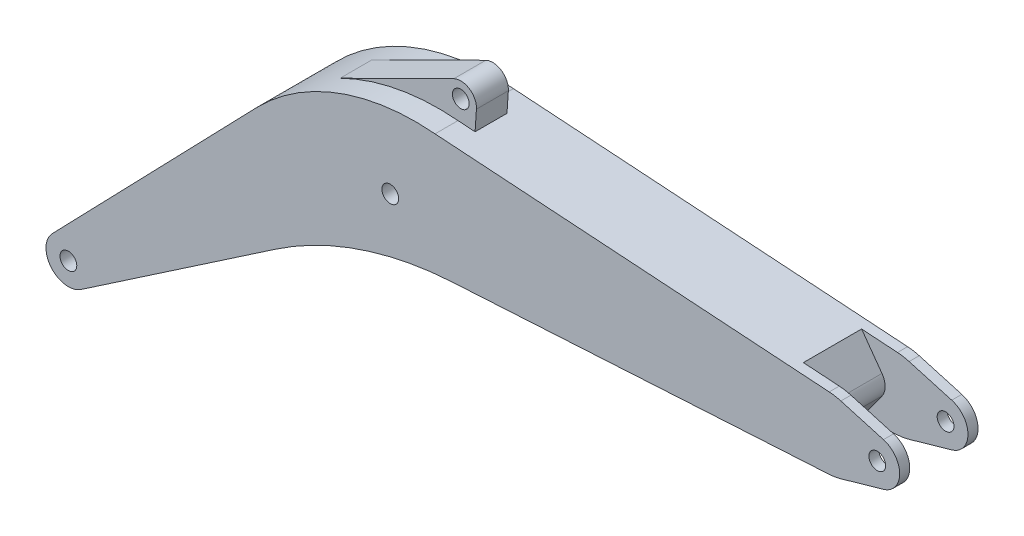
ISO-10303-21;
HEADER;
FILE_DESCRIPTION(('STEP AP214'),'2;1');
FILE_NAME('part.step','',(''),(''),'','','');
FILE_SCHEMA(('AUTOMOTIVE_DESIGN { 1 0 10303 214 1 1 1 1 }'));
ENDSEC;
DATA;
#1=APPLICATION_CONTEXT('core data for automotive mechanical design processes');
#2=APPLICATION_PROTOCOL_DEFINITION('international standard','automotive_design',2000,#1);
#3=PRODUCT_CONTEXT('',#1,'mechanical');
#4=PRODUCT('Part','Part','',(#3));
#5=PRODUCT_RELATED_PRODUCT_CATEGORY('part','',(#4));
#6=PRODUCT_DEFINITION_FORMATION('','',#4);
#7=PRODUCT_DEFINITION_CONTEXT('part definition',#1,'design');
#8=PRODUCT_DEFINITION('design','',#6,#7);
#9=PRODUCT_DEFINITION_SHAPE('','',#8);
#10=(LENGTH_UNIT() NAMED_UNIT(*) SI_UNIT(.MILLI.,.METRE.));
#11=(NAMED_UNIT(*) PLANE_ANGLE_UNIT() SI_UNIT($,.RADIAN.));
#12=(NAMED_UNIT(*) SI_UNIT($,.STERADIAN.) SOLID_ANGLE_UNIT());
#13=UNCERTAINTY_MEASURE_WITH_UNIT(LENGTH_MEASURE(1.E-05),#10,'distance_accuracy_value','');
#14=(GEOMETRIC_REPRESENTATION_CONTEXT(3) GLOBAL_UNCERTAINTY_ASSIGNED_CONTEXT((#13)) GLOBAL_UNIT_ASSIGNED_CONTEXT((#10,
#11,#12)) REPRESENTATION_CONTEXT('',''));
#15=CARTESIAN_POINT('',(0.,0.,0.));
#16=DIRECTION('',(0.,0.,1.));
#17=DIRECTION('',(1.,0.,0.));
#18=AXIS2_PLACEMENT_3D('',#15,#16,#17);
#19=CARTESIAN_POINT('',(239.6,101.8,-7.));
#20=DIRECTION('',(0.,0.,1.));
#21=DIRECTION('',(1.,0.,0.));
#22=AXIS2_PLACEMENT_3D('',#19,#20,#21);
#23=CYLINDRICAL_SURFACE('',#22,4.);
#24=CARTESIAN_POINT('',(239.6,101.8,-5.2));
#25=DIRECTION('',(0.,0.,1.));
#26=DIRECTION('',(1.,0.,0.));
#27=AXIS2_PLACEMENT_3D('',#24,#25,#26);
#28=CIRCLE('',#27,4.00000000000001);
#29=CARTESIAN_POINT('',(240.699236037552,97.9540046628022,-5.2));
#30=VERTEX_POINT('',#29);
#31=CARTESIAN_POINT('',(240.699236037552,105.645995337198,-5.2));
#32=VERTEX_POINT('',#31);
#33=EDGE_CURVE('E438',#30,#32,#28,.T.);
#34=ORIENTED_EDGE('',*,*,#33,.F.);
#35=DIRECTION('',(0.,0.,1.));
#36=VECTOR('',#35,1.);
#37=CARTESIAN_POINT('',(240.699236037552,97.9540046628022,-7.));
#38=LINE('',#37,#36);
#39=CARTESIAN_POINT('',(240.699236037552,97.9540046628022,-7.));
#40=VERTEX_POINT('',#39);
#41=EDGE_CURVE('E282',#40,#30,#38,.T.);
#42=ORIENTED_EDGE('',*,*,#41,.F.);
#43=CARTESIAN_POINT('',(239.6,101.8,-7.));
#44=DIRECTION('',(0.,0.,1.));
#45=DIRECTION('',(1.,0.,0.));
#46=AXIS2_PLACEMENT_3D('',#43,#44,#45);
#47=CIRCLE('',#46,4.);
#48=CARTESIAN_POINT('',(240.699236037552,105.645995337198,-7.));
#49=VERTEX_POINT('',#48);
#50=EDGE_CURVE('E309',#49,#40,#47,.F.);
#51=ORIENTED_EDGE('',*,*,#50,.F.);
#52=DIRECTION('',(0.,0.,1.));
#53=VECTOR('',#52,1.);
#54=CARTESIAN_POINT('',(240.699236037552,105.645995337198,-7.));
#55=LINE('',#54,#53);
#56=EDGE_CURVE('E264',#49,#32,#55,.T.);
#57=ORIENTED_EDGE('',*,*,#56,.T.);
#58=EDGE_LOOP('',(#34,#42,#51,#57));
#59=FACE_BOUND('',#58,.T.);
#60=ADVANCED_FACE('F43',(#59),#23,.T.);
#61=CARTESIAN_POINT('',(-7.70463955939015,26.9569108070672,-7.));
#62=DIRECTION('',(0.274809009388006,-0.96149883429944,0.));
#63=DIRECTION('',(0.961498834299441,0.274809009388006,0.));
#64=AXIS2_PLACEMENT_3D('',#61,#62,#63);
#65=PLANE('',#64);
#66=ORIENTED_EDGE('',*,*,#41,.T.);
#67=DIRECTION('',(0.96149883429944,0.274809009388006,0.));
#68=VECTOR('',#67,1.);
#69=CARTESIAN_POINT('',(-7.70463955939016,26.9569108070673,-5.2));
#70=LINE('',#69,#68);
#71=CARTESIAN_POINT('',(233.134897692902,95.7920173020132,-5.2));
#72=VERTEX_POINT('',#71);
#73=EDGE_CURVE('E439',#72,#30,#70,.T.);
#74=ORIENTED_EDGE('',*,*,#73,.F.);
#75=DIRECTION('',(0.,0.,1.));
#76=VECTOR('',#75,1.);
#77=CARTESIAN_POINT('',(233.134897692902,95.7920173020131,-7.));
#78=LINE('',#77,#76);
#79=CARTESIAN_POINT('',(233.134897692902,95.7920173020131,-7.));
#80=VERTEX_POINT('',#79);
#81=EDGE_CURVE('E259',#72,#80,#78,.F.);
#82=ORIENTED_EDGE('',*,*,#81,.T.);
#83=DIRECTION('',(0.96149883429944,0.274809009388006,0.));
#84=VECTOR('',#83,1.);
#85=CARTESIAN_POINT('',(-7.70463955939015,26.9569108070672,-7.));
#86=LINE('',#85,#84);
#87=EDGE_CURVE('E290',#80,#40,#86,.T.);
#88=ORIENTED_EDGE('',*,*,#87,.T.);
#89=EDGE_LOOP('',(#66,#74,#82,#88));
#90=FACE_BOUND('',#89,.T.);
#91=ADVANCED_FACE('F479',(#90),#65,.T.);
#92=CARTESIAN_POINT('',(239.6,101.8,-7.));
#93=DIRECTION('',(0.,0.,1.));
#94=DIRECTION('',(1.,0.,0.));
#95=AXIS2_PLACEMENT_3D('',#92,#93,#94);
#96=CYLINDRICAL_SURFACE('',#95,1.5);
#97=CARTESIAN_POINT('',(239.6,101.8,-7.));
#98=DIRECTION('',(0.,0.,1.));
#99=DIRECTION('',(1.,0.,0.));
#100=AXIS2_PLACEMENT_3D('',#97,#98,#99);
#101=CIRCLE('',#100,1.5);
#102=CARTESIAN_POINT('',(241.1,101.8,-7.));
#103=VERTEX_POINT('',#102);
#104=EDGE_CURVE('E312',#103,#103,#101,.T.);
#105=ORIENTED_EDGE('',*,*,#104,.F.);
#106=EDGE_LOOP('',(#105));
#107=FACE_BOUND('',#106,.T.);
#108=CARTESIAN_POINT('',(239.6,101.8,-5.2));
#109=DIRECTION('',(0.,0.,1.));
#110=DIRECTION('',(1.,0.,0.));
#111=AXIS2_PLACEMENT_3D('',#108,#109,#110);
#112=CIRCLE('',#111,1.5);
#113=CARTESIAN_POINT('',(241.1,101.8,-5.2));
#114=VERTEX_POINT('',#113);
#115=EDGE_CURVE('E405',#114,#114,#112,.F.);
#116=ORIENTED_EDGE('',*,*,#115,.F.);
#117=EDGE_LOOP('',(#116));
#118=FACE_BOUND('',#117,.T.);
#119=ADVANCED_FACE('F568',(#107,#118),#96,.F.);
#120=CARTESIAN_POINT('',(46.0922916287721,161.267218894861,-7.));
#121=DIRECTION('',(-0.274809009387999,-0.961498834299442,0.));
#122=DIRECTION('',(0.961498834299443,-0.274809009387999,0.));
#123=AXIS2_PLACEMENT_3D('',#120,#121,#122);
#124=PLANE('',#123);
#125=DIRECTION('',(-0.961498834299442,0.274809009387999,0.));
#126=VECTOR('',#125,1.);
#127=CARTESIAN_POINT('',(46.0922916287723,161.267218894861,-5.2));
#128=LINE('',#127,#126);
#129=CARTESIAN_POINT('',(233.092512669216,107.820096895068,-5.2));
#130=VERTEX_POINT('',#129);
#131=EDGE_CURVE('E59',#32,#130,#128,.T.);
#132=ORIENTED_EDGE('',*,*,#131,.F.);
#133=ORIENTED_EDGE('',*,*,#56,.F.);
#134=DIRECTION('',(0.961498834299443,-0.274809009387999,0.));
#135=VECTOR('',#134,1.);
#136=CARTESIAN_POINT('',(46.0922916287721,161.267218894861,-7.));
#137=LINE('',#136,#135);
#138=CARTESIAN_POINT('',(233.092512669216,107.820096895068,-7.));
#139=VERTEX_POINT('',#138);
#140=EDGE_CURVE('E308',#139,#49,#137,.T.);
#141=ORIENTED_EDGE('',*,*,#140,.F.);
#142=DIRECTION('',(0.,0.,1.));
#143=VECTOR('',#142,1.);
#144=CARTESIAN_POINT('',(233.092512669216,107.820096895068,-7.));
#145=LINE('',#144,#143);
#146=EDGE_CURVE('E244',#139,#130,#145,.T.);
#147=ORIENTED_EDGE('',*,*,#146,.T.);
#148=EDGE_LOOP('',(#132,#133,#141,#147));
#149=FACE_BOUND('',#148,.T.);
#150=ADVANCED_FACE('F488',(#149),#124,.F.);
#151=CARTESIAN_POINT('',(230.386807599022,105.407005645008,-7.));
#152=DIRECTION('',(0.,0.,1.));
#153=DIRECTION('',(1.,0.,0.));
#154=AXIS2_PLACEMENT_3D('',#151,#152,#153);
#155=CYLINDRICAL_SURFACE('',#154,10.);
#156=ORIENTED_EDGE('',*,*,#81,.F.);
#157=CARTESIAN_POINT('',(230.386807599022,105.407005645008,-5.2));
#158=DIRECTION('',(0.,0.,1.));
#159=DIRECTION('',(1.,0.,0.));
#160=AXIS2_PLACEMENT_3D('',#157,#158,#159);
#161=CIRCLE('',#160,10.);
#162=CARTESIAN_POINT('',(230.96828099156,95.423925524435,-5.2));
#163=VERTEX_POINT('',#162);
#164=EDGE_CURVE('E445',#163,#72,#161,.T.);
#165=ORIENTED_EDGE('',*,*,#164,.F.);
#166=DIRECTION('',(0.,0.,1.));
#167=VECTOR('',#166,1.);
#168=CARTESIAN_POINT('',(230.96828099156,95.423925524435,-7.));
#169=LINE('',#168,#167);
#170=CARTESIAN_POINT('',(230.96828099156,95.423925524435,-7.));
#171=VERTEX_POINT('',#170);
#172=EDGE_CURVE('E261',#171,#163,#169,.T.);
#173=ORIENTED_EDGE('',*,*,#172,.F.);
#174=CARTESIAN_POINT('',(230.386807599022,105.407005645008,-7.));
#175=DIRECTION('',(0.,0.,1.));
#176=DIRECTION('',(1.,0.,0.));
#177=AXIS2_PLACEMENT_3D('',#174,#175,#176);
#178=CIRCLE('',#177,10.);
#179=EDGE_CURVE('E248',#80,#171,#178,.F.);
#180=ORIENTED_EDGE('',*,*,#179,.F.);
#181=EDGE_LOOP('',(#156,#165,#173,#180));
#182=FACE_BOUND('',#181,.T.);
#183=ADVANCED_FACE('F476',(#182),#155,.T.);
#184=CARTESIAN_POINT('',(230.344422575336,98.2051085520736,-7.));
#185=DIRECTION('',(0.,0.,1.));
#186=DIRECTION('',(1.,0.,0.));
#187=AXIS2_PLACEMENT_3D('',#184,#185,#186);
#188=CYLINDRICAL_SURFACE('',#187,10.);
#189=DIRECTION('',(0.,0.,1.));
#190=VECTOR('',#189,1.);
#191=CARTESIAN_POINT('',(231.012866709461,108.1827426624,-7.));
#192=LINE('',#191,#190);
#193=CARTESIAN_POINT('',(231.012866709461,108.1827426624,-5.2));
#194=VERTEX_POINT('',#193);
#195=CARTESIAN_POINT('',(231.012866709461,108.1827426624,-7.));
#196=VERTEX_POINT('',#195);
#197=EDGE_CURVE('E51',#194,#196,#192,.F.);
#198=ORIENTED_EDGE('',*,*,#197,.F.);
#199=CARTESIAN_POINT('',(230.344422575336,98.2051085520736,-5.2));
#200=DIRECTION('',(0.,0.,1.));
#201=DIRECTION('',(1.,0.,0.));
#202=AXIS2_PLACEMENT_3D('',#199,#200,#201);
#203=CIRCLE('',#202,10.);
#204=EDGE_CURVE('E225',#130,#194,#203,.T.);
#205=ORIENTED_EDGE('',*,*,#204,.F.);
#206=ORIENTED_EDGE('',*,*,#146,.F.);
#207=CARTESIAN_POINT('',(230.344422575336,98.2051085520736,-7.));
#208=DIRECTION('',(0.,0.,1.));
#209=DIRECTION('',(1.,0.,0.));
#210=AXIS2_PLACEMENT_3D('',#207,#208,#209);
#211=CIRCLE('',#210,10.);
#212=EDGE_CURVE('E242',#196,#139,#211,.F.);
#213=ORIENTED_EDGE('',*,*,#212,.F.);
#214=EDGE_LOOP('',(#198,#205,#206,#213));
#215=FACE_BOUND('',#214,.T.);
#216=ADVANCED_FACE('F243',(#215),#188,.T.);
#217=CARTESIAN_POINT('',(157.122777031615,73.5145724950818,-7.));
#218=DIRECTION('',(0.,0.,1.));
#219=DIRECTION('',(1.,0.,0.));
#220=AXIS2_PLACEMENT_3D('',#217,#218,#219);
#221=CYLINDRICAL_SURFACE('',#220,39.5386264217288);
#222=CARTESIAN_POINT('',(157.122777031615,73.5145724950818,-2.8));
#223=DIRECTION('',(0.,0.,1.));
#224=DIRECTION('',(1.,0.,0.));
#225=AXIS2_PLACEMENT_3D('',#222,#223,#224);
#226=CIRCLE('',#225,39.5386264217288);
#227=CARTESIAN_POINT('',(160.6,112.9,-2.8));
#228=VERTEX_POINT('',#227);
#229=CARTESIAN_POINT('',(139.549521827012,108.93326361758,-2.8));
#230=VERTEX_POINT('',#229);
#231=EDGE_CURVE('E384',#228,#230,#226,.T.);
#232=ORIENTED_EDGE('',*,*,#231,.F.);
#233=DIRECTION('',(0.,0.,1.));
#234=VECTOR('',#233,1.);
#235=CARTESIAN_POINT('',(160.6,112.9,-7.));
#236=LINE('',#235,#234);
#237=CARTESIAN_POINT('',(160.6,112.9,-7.));
#238=VERTEX_POINT('',#237);
#239=EDGE_CURVE('E267',#238,#228,#236,.T.);
#240=ORIENTED_EDGE('',*,*,#239,.F.);
#241=CARTESIAN_POINT('',(157.122777031615,73.5145724950818,-7.));
#242=DIRECTION('',(0.,0.,1.));
#243=DIRECTION('',(1.,0.,0.));
#244=AXIS2_PLACEMENT_3D('',#241,#242,#243);
#245=CIRCLE('',#244,39.5386264217288);
#246=CARTESIAN_POINT('',(128.7,101.,-7.));
#247=VERTEX_POINT('',#246);
#248=EDGE_CURVE('E302',#247,#238,#245,.F.);
#249=ORIENTED_EDGE('',*,*,#248,.F.);
#250=DIRECTION('',(0.,0.,1.));
#251=VECTOR('',#250,1.);
#252=CARTESIAN_POINT('',(128.7,101.,-7.));
#253=LINE('',#252,#251);
#254=CARTESIAN_POINT('',(128.7,101.,7.));
#255=VERTEX_POINT('',#254);
#256=EDGE_CURVE('E271',#247,#255,#253,.T.);
#257=ORIENTED_EDGE('',*,*,#256,.T.);
#258=CARTESIAN_POINT('',(157.122777031615,73.5145724950818,7.));
#259=DIRECTION('',(0.,0.,1.));
#260=DIRECTION('',(1.,0.,0.));
#261=AXIS2_PLACEMENT_3D('',#258,#259,#260);
#262=CIRCLE('',#261,39.5386264217288);
#263=CARTESIAN_POINT('',(160.6,112.9,7.));
#264=VERTEX_POINT('',#263);
#265=EDGE_CURVE('E338',#255,#264,#262,.F.);
#266=ORIENTED_EDGE('',*,*,#265,.T.);
#267=CARTESIAN_POINT('',(160.6,112.9,2.9));
#268=VERTEX_POINT('',#267);
#269=EDGE_CURVE('E266',#268,#264,#236,.T.);
#270=ORIENTED_EDGE('',*,*,#269,.F.);
#271=CARTESIAN_POINT('',(157.122777031615,73.5145724950818,2.9));
#272=DIRECTION('',(0.,0.,1.));
#273=DIRECTION('',(1.,0.,0.));
#274=AXIS2_PLACEMENT_3D('',#271,#272,#273);
#275=CIRCLE('',#274,39.5386264217288);
#276=CARTESIAN_POINT('',(139.549521827012,108.93326361758,2.9));
#277=VERTEX_POINT('',#276);
#278=EDGE_CURVE('E66',#268,#277,#275,.T.);
#279=ORIENTED_EDGE('',*,*,#278,.T.);
#280=DIRECTION('',(0.,0.,1.));
#281=VECTOR('',#280,1.);
#282=CARTESIAN_POINT('',(139.549521827012,108.93326361758,-2.8));
#283=LINE('',#282,#281);
#284=EDGE_CURVE('E363',#230,#277,#283,.T.);
#285=ORIENTED_EDGE('',*,*,#284,.F.);
#286=EDGE_LOOP('',(#232,#240,#249,#257,#266,#270,#279,#285));
#287=FACE_BOUND('',#286,.T.);
#288=ADVANCED_FACE('F492',(#287),#221,.T.);
#289=CARTESIAN_POINT('',(8.24744433372268,123.106745509798,-7.));
#290=DIRECTION('',(-0.0668444134124416,-0.997763411032669,0.));
#291=DIRECTION('',(0.997763411032669,-0.0668444134124416,0.));
#292=AXIS2_PLACEMENT_3D('',#289,#290,#291);
#293=PLANE('',#292);
#294=CARTESIAN_POINT('',(231.012866709461,108.1827426624,7.));
#295=VERTEX_POINT('',#294);
#296=CARTESIAN_POINT('',(231.012866709461,108.1827426624,5.2));
#297=VERTEX_POINT('',#296);
#298=EDGE_CURVE('E11',#295,#297,#192,.F.);
#299=ORIENTED_EDGE('',*,*,#298,.T.);
#300=DIRECTION('',(-0.997763411032669,0.0668444134124416,0.));
#301=VECTOR('',#300,1.);
#302=CARTESIAN_POINT('',(8.24744433372268,123.106745509798,5.2));
#303=LINE('',#302,#301);
#304=CARTESIAN_POINT('',(224.6,108.612367870888,5.2));
#305=VERTEX_POINT('',#304);
#306=EDGE_CURVE('E427',#297,#305,#303,.T.);
#307=ORIENTED_EDGE('',*,*,#306,.T.);
#308=DIRECTION('',(0.,0.,-1.));
#309=VECTOR('',#308,1.);
#310=CARTESIAN_POINT('',(224.6,108.612367870888,5.2));
#311=LINE('',#310,#309);
#312=CARTESIAN_POINT('',(224.6,108.612367870888,-5.2));
#313=VERTEX_POINT('',#312);
#314=EDGE_CURVE('E237',#305,#313,#311,.T.);
#315=ORIENTED_EDGE('',*,*,#314,.T.);
#316=DIRECTION('',(-0.997763411032669,0.0668444134124416,0.));
#317=VECTOR('',#316,1.);
#318=CARTESIAN_POINT('',(8.24744433372268,123.106745509798,-5.2));
#319=LINE('',#318,#317);
#320=EDGE_CURVE('E227',#194,#313,#319,.T.);
#321=ORIENTED_EDGE('',*,*,#320,.F.);
#322=ORIENTED_EDGE('',*,*,#197,.T.);
#323=DIRECTION('',(0.997763411032669,-0.0668444134124416,0.));
#324=VECTOR('',#323,1.);
#325=CARTESIAN_POINT('',(8.24744433372268,123.106745509798,-7.));
#326=LINE('',#325,#324);
#327=EDGE_CURVE('E306',#238,#196,#326,.T.);
#328=ORIENTED_EDGE('',*,*,#327,.F.);
#329=ORIENTED_EDGE('',*,*,#239,.T.);
#330=DIRECTION('',(-0.997763411032669,0.0668444134124416,0.));
#331=VECTOR('',#330,1.);
#332=CARTESIAN_POINT('',(8.24744433372268,123.106745509798,-2.8));
#333=LINE('',#332,#331);
#334=CARTESIAN_POINT('',(163.651401787324,112.695573619654,-2.8));
#335=VERTEX_POINT('',#334);
#336=EDGE_CURVE('E382',#335,#228,#333,.T.);
#337=ORIENTED_EDGE('',*,*,#336,.F.);
#338=DIRECTION('',(0.,0.,1.));
#339=VECTOR('',#338,1.);
#340=CARTESIAN_POINT('',(163.651401787324,112.695573619654,-2.8));
#341=LINE('',#340,#339);
#342=CARTESIAN_POINT('',(163.651401787324,112.695573619654,2.9));
#343=VERTEX_POINT('',#342);
#344=EDGE_CURVE('E365',#335,#343,#341,.T.);
#345=ORIENTED_EDGE('',*,*,#344,.T.);
#346=DIRECTION('',(-0.997763411032669,0.0668444134124416,0.));
#347=VECTOR('',#346,1.);
#348=CARTESIAN_POINT('',(8.24744433372268,123.106745509798,2.9));
#349=LINE('',#348,#347);
#350=EDGE_CURVE('E398',#343,#268,#349,.T.);
#351=ORIENTED_EDGE('',*,*,#350,.T.);
#352=ORIENTED_EDGE('',*,*,#269,.T.);
#353=DIRECTION('',(0.997763411032669,-0.0668444134124416,0.));
#354=VECTOR('',#353,1.);
#355=CARTESIAN_POINT('',(8.24744433372268,123.106745509798,7.));
#356=LINE('',#355,#354);
#357=EDGE_CURVE('E345',#264,#295,#356,.T.);
#358=ORIENTED_EDGE('',*,*,#357,.T.);
#359=EDGE_LOOP('',(#299,#307,#315,#321,#322,#328,#329,#337,#345,#351,#352,#358));
#360=FACE_BOUND('',#359,.T.);
#361=ADVANCED_FACE('F232',(#360),#293,.F.);
#362=CARTESIAN_POINT('',(240.699236037552,97.9540046628022,5.2));
#363=VERTEX_POINT('',#362);
#364=CARTESIAN_POINT('',(240.699236037552,97.9540046628022,7.));
#365=VERTEX_POINT('',#364);
#366=EDGE_CURVE('E283',#363,#365,#38,.T.);
#367=ORIENTED_EDGE('',*,*,#366,.F.);
#368=CARTESIAN_POINT('',(239.6,101.8,5.2));
#369=DIRECTION('',(0.,0.,1.));
#370=DIRECTION('',(1.,0.,0.));
#371=AXIS2_PLACEMENT_3D('',#368,#369,#370);
#372=CIRCLE('',#371,4.00000000000001);
#373=CARTESIAN_POINT('',(240.699236037552,105.645995337198,5.2));
#374=VERTEX_POINT('',#373);
#375=EDGE_CURVE('E415',#363,#374,#372,.T.);
#376=ORIENTED_EDGE('',*,*,#375,.T.);
#377=CARTESIAN_POINT('',(240.699236037552,105.645995337198,7.));
#378=VERTEX_POINT('',#377);
#379=EDGE_CURVE('E269',#374,#378,#55,.T.);
#380=ORIENTED_EDGE('',*,*,#379,.T.);
#381=CARTESIAN_POINT('',(239.6,101.8,7.));
#382=DIRECTION('',(0.,0.,1.));
#383=DIRECTION('',(1.,0.,0.));
#384=AXIS2_PLACEMENT_3D('',#381,#382,#383);
#385=CIRCLE('',#384,4.);
#386=EDGE_CURVE('E347',#378,#365,#385,.F.);
#387=ORIENTED_EDGE('',*,*,#386,.T.);
#388=EDGE_LOOP('',(#367,#376,#380,#387));
#389=FACE_BOUND('',#388,.T.);
#390=ADVANCED_FACE('F535',(#389),#23,.T.);
#391=DIRECTION('',(0.96149883429944,0.274809009388006,0.));
#392=VECTOR('',#391,1.);
#393=CARTESIAN_POINT('',(-7.70463955939016,26.9569108070673,5.2));
#394=LINE('',#393,#392);
#395=CARTESIAN_POINT('',(233.134897692902,95.7920173020132,5.2));
#396=VERTEX_POINT('',#395);
#397=EDGE_CURVE('E414',#396,#363,#394,.T.);
#398=ORIENTED_EDGE('',*,*,#397,.T.);
#399=ORIENTED_EDGE('',*,*,#366,.T.);
#400=DIRECTION('',(0.96149883429944,0.274809009388006,0.));
#401=VECTOR('',#400,1.);
#402=CARTESIAN_POINT('',(-7.70463955939015,26.9569108070672,7.));
#403=LINE('',#402,#401);
#404=CARTESIAN_POINT('',(233.134897692902,95.7920173020131,7.));
#405=VERTEX_POINT('',#404);
#406=EDGE_CURVE('E321',#405,#365,#403,.T.);
#407=ORIENTED_EDGE('',*,*,#406,.F.);
#408=EDGE_CURVE('E254',#405,#396,#78,.F.);
#409=ORIENTED_EDGE('',*,*,#408,.T.);
#410=EDGE_LOOP('',(#398,#399,#407,#409));
#411=FACE_BOUND('',#410,.T.);
#412=ADVANCED_FACE('F534',(#411),#65,.T.);
#413=CARTESIAN_POINT('',(-4.75832925411046,81.69381917294,-7.));
#414=DIRECTION('',(0.0581473392537677,-0.998308012057254,0.));
#415=DIRECTION('',(0.998308012057255,0.0581473392537677,0.));
#416=AXIS2_PLACEMENT_3D('',#413,#414,#415);
#417=PLANE('',#416);
#418=DIRECTION('',(0.998308012057255,0.0581473392537677,0.));
#419=VECTOR('',#418,1.);
#420=CARTESIAN_POINT('',(-4.75832925411046,81.69381917294,5.2));
#421=LINE('',#420,#419);
#422=CARTESIAN_POINT('',(224.6,95.0529993265009,5.2));
#423=VERTEX_POINT('',#422);
#424=CARTESIAN_POINT('',(230.96828099156,95.423925524435,5.2));
#425=VERTEX_POINT('',#424);
#426=EDGE_CURVE('E423',#423,#425,#421,.T.);
#427=ORIENTED_EDGE('',*,*,#426,.T.);
#428=CARTESIAN_POINT('',(230.96828099156,95.423925524435,7.));
#429=VERTEX_POINT('',#428);
#430=EDGE_CURVE('E262',#425,#429,#169,.T.);
#431=ORIENTED_EDGE('',*,*,#430,.T.);
#432=DIRECTION('',(0.998308012057255,0.0581473392537677,0.));
#433=VECTOR('',#432,1.);
#434=CARTESIAN_POINT('',(-4.75832925411046,81.69381917294,7.));
#435=LINE('',#434,#433);
#436=CARTESIAN_POINT('',(163.6,91.5,7.));
#437=VERTEX_POINT('',#436);
#438=EDGE_CURVE('E322',#437,#429,#435,.T.);
#439=ORIENTED_EDGE('',*,*,#438,.F.);
#440=DIRECTION('',(0.,0.,1.));
#441=VECTOR('',#440,1.);
#442=CARTESIAN_POINT('',(163.6,91.5,-7.));
#443=LINE('',#442,#441);
#444=CARTESIAN_POINT('',(163.6,91.5,-7.));
#445=VERTEX_POINT('',#444);
#446=EDGE_CURVE('E281',#445,#437,#443,.T.);
#447=ORIENTED_EDGE('',*,*,#446,.F.);
#448=DIRECTION('',(0.998308012057255,0.0581473392537677,0.));
#449=VECTOR('',#448,1.);
#450=CARTESIAN_POINT('',(-4.75832925411046,81.69381917294,-7.));
#451=LINE('',#450,#449);
#452=EDGE_CURVE('E286',#445,#171,#451,.T.);
#453=ORIENTED_EDGE('',*,*,#452,.T.);
#454=ORIENTED_EDGE('',*,*,#172,.T.);
#455=DIRECTION('',(0.998308012057255,0.0581473392537677,0.));
#456=VECTOR('',#455,1.);
#457=CARTESIAN_POINT('',(-4.75832925411046,81.69381917294,-5.2));
#458=LINE('',#457,#456);
#459=CARTESIAN_POINT('',(224.6,95.0529993265009,-5.2));
#460=VERTEX_POINT('',#459);
#461=EDGE_CURVE('E443',#460,#163,#458,.T.);
#462=ORIENTED_EDGE('',*,*,#461,.F.);
#463=DIRECTION('',(0.,0.,-1.));
#464=VECTOR('',#463,1.);
#465=CARTESIAN_POINT('',(224.6,95.0529993265009,5.2));
#466=LINE('',#465,#464);
#467=EDGE_CURVE('E407',#423,#460,#466,.T.);
#468=ORIENTED_EDGE('',*,*,#467,.F.);
#469=EDGE_LOOP('',(#427,#431,#439,#447,#453,#454,#462,#468));
#470=FACE_BOUND('',#469,.T.);
#471=ADVANCED_FACE('F468',(#470),#417,.T.);
#472=CARTESIAN_POINT('',(167.235713862044,29.0799077893089,-7.));
#473=DIRECTION('',(0.,0.,1.));
#474=DIRECTION('',(1.,0.,0.));
#475=AXIS2_PLACEMENT_3D('',#472,#473,#474);
#476=CYLINDRICAL_SURFACE('',#475,62.5258852546515);
#477=ORIENTED_EDGE('',*,*,#446,.T.);
#478=CARTESIAN_POINT('',(167.235713862044,29.0799077893089,7.));
#479=DIRECTION('',(0.,0.,1.));
#480=DIRECTION('',(1.,0.,0.));
#481=AXIS2_PLACEMENT_3D('',#478,#479,#480);
#482=CIRCLE('',#481,62.5258852546515);
#483=CARTESIAN_POINT('',(132.1,80.8,7.));
#484=VERTEX_POINT('',#483);
#485=EDGE_CURVE('E328',#484,#437,#482,.F.);
#486=ORIENTED_EDGE('',*,*,#485,.F.);
#487=DIRECTION('',(0.,0.,1.));
#488=VECTOR('',#487,1.);
#489=CARTESIAN_POINT('',(132.1,80.8,-7.));
#490=LINE('',#489,#488);
#491=CARTESIAN_POINT('',(132.1,80.8,-7.));
#492=VERTEX_POINT('',#491);
#493=EDGE_CURVE('E278',#492,#484,#490,.T.);
#494=ORIENTED_EDGE('',*,*,#493,.F.);
#495=CARTESIAN_POINT('',(167.235713862044,29.0799077893089,-7.));
#496=DIRECTION('',(0.,0.,1.));
#497=DIRECTION('',(1.,0.,0.));
#498=AXIS2_PLACEMENT_3D('',#495,#496,#497);
#499=CIRCLE('',#498,62.5258852546515);
#500=EDGE_CURVE('E292',#492,#445,#499,.F.);
#501=ORIENTED_EDGE('',*,*,#500,.T.);
#502=EDGE_LOOP('',(#477,#486,#494,#501));
#503=FACE_BOUND('',#502,.T.);
#504=ADVANCED_FACE('F547',(#503),#476,.F.);
#505=CARTESIAN_POINT('',(4.15612462087752,-6.1178534602969,-7.));
#506=DIRECTION('',(0.561938686976534,-0.827178887592696,0.));
#507=DIRECTION('',(0.827178887592696,0.561938686976534,0.));
#508=AXIS2_PLACEMENT_3D('',#505,#506,#507);
#509=PLANE('',#508);
#510=ORIENTED_EDGE('',*,*,#493,.T.);
#511=DIRECTION('',(0.827178887592696,0.561938686976534,0.));
#512=VECTOR('',#511,1.);
#513=CARTESIAN_POINT('',(4.15612462087752,-6.1178534602969,7.));
#514=LINE('',#513,#512);
#515=CARTESIAN_POINT('',(97.3477547479061,57.1912844496292,7.));
#516=VERTEX_POINT('',#515);
#517=EDGE_CURVE('E333',#516,#484,#514,.T.);
#518=ORIENTED_EDGE('',*,*,#517,.F.);
#519=DIRECTION('',(0.,0.,1.));
#520=VECTOR('',#519,1.);
#521=CARTESIAN_POINT('',(97.3477547479061,57.1912844496292,-7.));
#522=LINE('',#521,#520);
#523=CARTESIAN_POINT('',(97.3477547479061,57.1912844496292,-7.));
#524=VERTEX_POINT('',#523);
#525=EDGE_CURVE('E276',#524,#516,#522,.T.);
#526=ORIENTED_EDGE('',*,*,#525,.F.);
#527=DIRECTION('',(0.827178887592696,0.561938686976534,0.));
#528=VECTOR('',#527,1.);
#529=CARTESIAN_POINT('',(4.15612462087752,-6.1178534602969,-7.));
#530=LINE('',#529,#528);
#531=EDGE_CURVE('E294',#524,#492,#530,.T.);
#532=ORIENTED_EDGE('',*,*,#531,.T.);
#533=EDGE_LOOP('',(#510,#518,#526,#532));
#534=FACE_BOUND('',#533,.T.);
#535=ADVANCED_FACE('F553',(#534),#509,.T.);
#536=CARTESIAN_POINT('',(95.1,60.5,-7.));
#537=DIRECTION('',(0.,0.,1.));
#538=DIRECTION('',(1.,0.,0.));
#539=AXIS2_PLACEMENT_3D('',#536,#537,#538);
#540=CYLINDRICAL_SURFACE('',#539,4.00000000000001);
#541=ORIENTED_EDGE('',*,*,#525,.T.);
#542=CARTESIAN_POINT('',(95.1,60.5,7.));
#543=DIRECTION('',(0.,0.,1.));
#544=DIRECTION('',(1.,0.,0.));
#545=AXIS2_PLACEMENT_3D('',#542,#543,#544);
#546=CIRCLE('',#545,4.00000000000001);
#547=CARTESIAN_POINT('',(92.224555949066,63.2806153113921,7.));
#548=VERTEX_POINT('',#547);
#549=EDGE_CURVE('E334',#548,#516,#546,.T.);
#550=ORIENTED_EDGE('',*,*,#549,.F.);
#551=DIRECTION('',(0.,0.,1.));
#552=VECTOR('',#551,1.);
#553=CARTESIAN_POINT('',(92.224555949066,63.2806153113921,-7.));
#554=LINE('',#553,#552);
#555=CARTESIAN_POINT('',(92.224555949066,63.2806153113921,-7.));
#556=VERTEX_POINT('',#555);
#557=EDGE_CURVE('E273',#556,#548,#554,.T.);
#558=ORIENTED_EDGE('',*,*,#557,.F.);
#559=CARTESIAN_POINT('',(95.1,60.5,-7.));
#560=DIRECTION('',(0.,0.,1.));
#561=DIRECTION('',(1.,0.,0.));
#562=AXIS2_PLACEMENT_3D('',#559,#560,#561);
#563=CIRCLE('',#562,4.00000000000001);
#564=EDGE_CURVE('E296',#556,#524,#563,.T.);
#565=ORIENTED_EDGE('',*,*,#564,.T.);
#566=EDGE_LOOP('',(#541,#550,#558,#565));
#567=FACE_BOUND('',#566,.T.);
#568=ADVANCED_FACE('F555',(#567),#540,.T.);
#569=CARTESIAN_POINT('',(16.0355432754198,-15.506710048363,-7.));
#570=DIRECTION('',(-0.718861012733494,0.695153827848035,0.));
#571=DIRECTION('',(-0.695153827848035,-0.718861012733494,0.));
#572=AXIS2_PLACEMENT_3D('',#569,#570,#571);
#573=PLANE('',#572);
#574=ORIENTED_EDGE('',*,*,#557,.T.);
#575=DIRECTION('',(-0.695153827848035,-0.718861012733494,0.));
#576=VECTOR('',#575,1.);
#577=CARTESIAN_POINT('',(16.0355432754198,-15.506710048363,7.));
#578=LINE('',#577,#576);
#579=EDGE_CURVE('E340',#255,#548,#578,.T.);
#580=ORIENTED_EDGE('',*,*,#579,.F.);
#581=ORIENTED_EDGE('',*,*,#256,.F.);
#582=DIRECTION('',(-0.695153827848035,-0.718861012733494,0.));
#583=VECTOR('',#582,1.);
#584=CARTESIAN_POINT('',(16.0355432754198,-15.506710048363,-7.));
#585=LINE('',#584,#583);
#586=EDGE_CURVE('E301',#247,#556,#585,.T.);
#587=ORIENTED_EDGE('',*,*,#586,.T.);
#588=EDGE_LOOP('',(#574,#580,#581,#587));
#589=FACE_BOUND('',#588,.T.);
#590=ADVANCED_FACE('F558',(#589),#573,.T.);
#591=CARTESIAN_POINT('',(239.6,101.8,5.2));
#592=DIRECTION('',(0.,0.,1.));
#593=DIRECTION('',(1.,0.,0.));
#594=AXIS2_PLACEMENT_3D('',#591,#592,#593);
#595=CIRCLE('',#594,1.5);
#596=CARTESIAN_POINT('',(241.1,101.8,5.2));
#597=VERTEX_POINT('',#596);
#598=EDGE_CURVE('E399',#597,#597,#595,.F.);
#599=ORIENTED_EDGE('',*,*,#598,.T.);
#600=EDGE_LOOP('',(#599));
#601=FACE_BOUND('',#600,.T.);
#602=CARTESIAN_POINT('',(239.6,101.8,7.));
#603=DIRECTION('',(0.,0.,1.));
#604=DIRECTION('',(1.,0.,0.));
#605=AXIS2_PLACEMENT_3D('',#602,#603,#604);
#606=CIRCLE('',#605,1.5);
#607=CARTESIAN_POINT('',(241.1,101.8,7.));
#608=VERTEX_POINT('',#607);
#609=EDGE_CURVE('E355',#608,#608,#606,.T.);
#610=ORIENTED_EDGE('',*,*,#609,.T.);
#611=EDGE_LOOP('',(#610));
#612=FACE_BOUND('',#611,.T.);
#613=ADVANCED_FACE('F556',(#601,#612),#96,.F.);
#614=CARTESIAN_POINT('',(152.6,99.6031393072044,-7.));
#615=DIRECTION('',(0.,0.,1.));
#616=DIRECTION('',(1.,0.,0.));
#617=AXIS2_PLACEMENT_3D('',#614,#615,#616);
#618=CYLINDRICAL_SURFACE('',#617,1.5);
#619=CARTESIAN_POINT('',(152.6,99.6031393072044,-7.));
#620=DIRECTION('',(0.,0.,1.));
#621=DIRECTION('',(1.,0.,0.));
#622=AXIS2_PLACEMENT_3D('',#619,#620,#621);
#623=CIRCLE('',#622,1.5);
#624=CARTESIAN_POINT('',(154.1,99.6031393072044,-7.));
#625=VERTEX_POINT('',#624);
#626=EDGE_CURVE('E317',#625,#625,#623,.T.);
#627=ORIENTED_EDGE('',*,*,#626,.F.);
#628=EDGE_LOOP('',(#627));
#629=FACE_BOUND('',#628,.T.);
#630=CARTESIAN_POINT('',(152.6,99.6031393072044,7.));
#631=DIRECTION('',(0.,0.,1.));
#632=DIRECTION('',(1.,0.,0.));
#633=AXIS2_PLACEMENT_3D('',#630,#631,#632);
#634=CIRCLE('',#633,1.5);
#635=CARTESIAN_POINT('',(154.1,99.6031393072044,7.));
#636=VERTEX_POINT('',#635);
#637=EDGE_CURVE('E353',#636,#636,#634,.T.);
#638=ORIENTED_EDGE('',*,*,#637,.T.);
#639=EDGE_LOOP('',(#638));
#640=FACE_BOUND('',#639,.T.);
#641=ADVANCED_FACE('F564',(#629,#640),#618,.F.);
#642=CARTESIAN_POINT('',(95.1,60.5,-7.));
#643=DIRECTION('',(0.,0.,1.));
#644=DIRECTION('',(1.,0.,0.));
#645=AXIS2_PLACEMENT_3D('',#642,#643,#644);
#646=CYLINDRICAL_SURFACE('',#645,1.5);
#647=CARTESIAN_POINT('',(95.1,60.5,-7.));
#648=DIRECTION('',(0.,0.,1.));
#649=DIRECTION('',(1.,0.,0.));
#650=AXIS2_PLACEMENT_3D('',#647,#648,#649);
#651=CIRCLE('',#650,1.5);
#652=CARTESIAN_POINT('',(96.6,60.5,-7.));
#653=VERTEX_POINT('',#652);
#654=EDGE_CURVE('E316',#653,#653,#651,.T.);
#655=ORIENTED_EDGE('',*,*,#654,.F.);
#656=EDGE_LOOP('',(#655));
#657=FACE_BOUND('',#656,.T.);
#658=CARTESIAN_POINT('',(95.1,60.5,7.));
#659=DIRECTION('',(0.,0.,1.));
#660=DIRECTION('',(1.,0.,0.));
#661=AXIS2_PLACEMENT_3D('',#658,#659,#660);
#662=CIRCLE('',#661,1.5);
#663=CARTESIAN_POINT('',(96.6,60.5,7.));
#664=VERTEX_POINT('',#663);
#665=EDGE_CURVE('E356',#664,#664,#662,.T.);
#666=ORIENTED_EDGE('',*,*,#665,.T.);
#667=EDGE_LOOP('',(#666));
#668=FACE_BOUND('',#667,.T.);
#669=ADVANCED_FACE('F589',(#657,#668),#646,.F.);
#670=ORIENTED_EDGE('',*,*,#379,.F.);
#671=DIRECTION('',(-0.961498834299442,0.274809009387999,0.));
#672=VECTOR('',#671,1.);
#673=CARTESIAN_POINT('',(46.0922916287723,161.267218894861,5.2));
#674=LINE('',#673,#672);
#675=CARTESIAN_POINT('',(233.092512669216,107.820096895068,5.2));
#676=VERTEX_POINT('',#675);
#677=EDGE_CURVE('E434',#374,#676,#674,.T.);
#678=ORIENTED_EDGE('',*,*,#677,.T.);
#679=CARTESIAN_POINT('',(233.092512669216,107.820096895068,7.));
#680=VERTEX_POINT('',#679);
#681=EDGE_CURVE('E246',#676,#680,#145,.T.);
#682=ORIENTED_EDGE('',*,*,#681,.T.);
#683=DIRECTION('',(0.961498834299443,-0.274809009387999,0.));
#684=VECTOR('',#683,1.);
#685=CARTESIAN_POINT('',(46.0922916287721,161.267218894861,7.));
#686=LINE('',#685,#684);
#687=EDGE_CURVE('E346',#680,#378,#686,.T.);
#688=ORIENTED_EDGE('',*,*,#687,.T.);
#689=EDGE_LOOP('',(#670,#678,#682,#688));
#690=FACE_BOUND('',#689,.T.);
#691=ADVANCED_FACE('F526',(#690),#124,.F.);
#692=CARTESIAN_POINT('',(0.,0.,-7.));
#693=DIRECTION('',(0.,0.,1.));
#694=DIRECTION('',(1.,0.,0.));
#695=AXIS2_PLACEMENT_3D('',#692,#693,#694);
#696=PLANE('',#695);
#697=ORIENTED_EDGE('',*,*,#654,.T.);
#698=EDGE_LOOP('',(#697));
#699=FACE_BOUND('',#698,.T.);
#700=ORIENTED_EDGE('',*,*,#626,.T.);
#701=EDGE_LOOP('',(#700));
#702=FACE_BOUND('',#701,.T.);
#703=ORIENTED_EDGE('',*,*,#104,.T.);
#704=EDGE_LOOP('',(#703));
#705=FACE_BOUND('',#704,.T.);
#706=ORIENTED_EDGE('',*,*,#87,.F.);
#707=ORIENTED_EDGE('',*,*,#179,.T.);
#708=ORIENTED_EDGE('',*,*,#452,.F.);
#709=ORIENTED_EDGE('',*,*,#500,.F.);
#710=ORIENTED_EDGE('',*,*,#531,.F.);
#711=ORIENTED_EDGE('',*,*,#564,.F.);
#712=ORIENTED_EDGE('',*,*,#586,.F.);
#713=ORIENTED_EDGE('',*,*,#248,.T.);
#714=ORIENTED_EDGE('',*,*,#327,.T.);
#715=ORIENTED_EDGE('',*,*,#212,.T.);
#716=ORIENTED_EDGE('',*,*,#140,.T.);
#717=ORIENTED_EDGE('',*,*,#50,.T.);
#718=EDGE_LOOP('',(#706,#707,#708,#709,#710,#711,#712,#713,#714,#715,#716,#717));
#719=FACE_BOUND('',#718,.T.);
#720=ADVANCED_FACE('F486',(#699,#702,#705,#719),#696,.F.);
#721=CARTESIAN_POINT('',(0.,0.,7.));
#722=DIRECTION('',(0.,0.,1.));
#723=DIRECTION('',(1.,0.,0.));
#724=AXIS2_PLACEMENT_3D('',#721,#722,#723);
#725=PLANE('',#724);
#726=ORIENTED_EDGE('',*,*,#665,.F.);
#727=EDGE_LOOP('',(#726));
#728=FACE_BOUND('',#727,.T.);
#729=ORIENTED_EDGE('',*,*,#637,.F.);
#730=EDGE_LOOP('',(#729));
#731=FACE_BOUND('',#730,.T.);
#732=ORIENTED_EDGE('',*,*,#609,.F.);
#733=EDGE_LOOP('',(#732));
#734=FACE_BOUND('',#733,.T.);
#735=ORIENTED_EDGE('',*,*,#438,.T.);
#736=CARTESIAN_POINT('',(230.386807599022,105.407005645008,7.));
#737=DIRECTION('',(0.,0.,1.));
#738=DIRECTION('',(1.,0.,0.));
#739=AXIS2_PLACEMENT_3D('',#736,#737,#738);
#740=CIRCLE('',#739,10.);
#741=EDGE_CURVE('E256',#429,#405,#740,.T.);
#742=ORIENTED_EDGE('',*,*,#741,.T.);
#743=ORIENTED_EDGE('',*,*,#406,.T.);
#744=ORIENTED_EDGE('',*,*,#386,.F.);
#745=ORIENTED_EDGE('',*,*,#687,.F.);
#746=CARTESIAN_POINT('',(230.344422575336,98.2051085520736,7.));
#747=DIRECTION('',(0.,0.,1.));
#748=DIRECTION('',(1.,0.,0.));
#749=AXIS2_PLACEMENT_3D('',#746,#747,#748);
#750=CIRCLE('',#749,10.);
#751=EDGE_CURVE('E258',#680,#295,#750,.T.);
#752=ORIENTED_EDGE('',*,*,#751,.T.);
#753=ORIENTED_EDGE('',*,*,#357,.F.);
#754=ORIENTED_EDGE('',*,*,#265,.F.);
#755=ORIENTED_EDGE('',*,*,#579,.T.);
#756=ORIENTED_EDGE('',*,*,#549,.T.);
#757=ORIENTED_EDGE('',*,*,#517,.T.);
#758=ORIENTED_EDGE('',*,*,#485,.T.);
#759=EDGE_LOOP('',(#735,#742,#743,#744,#745,#752,#753,#754,#755,#756,#757,#758));
#760=FACE_BOUND('',#759,.T.);
#761=ADVANCED_FACE('F516',(#728,#731,#734,#760),#725,.T.);
#762=CARTESIAN_POINT('',(230.386807599022,105.407005645008,5.2));
#763=DIRECTION('',(0.,0.,1.));
#764=DIRECTION('',(1.,0.,0.));
#765=AXIS2_PLACEMENT_3D('',#762,#763,#764);
#766=CIRCLE('',#765,10.);
#767=EDGE_CURVE('E419',#425,#396,#766,.T.);
#768=ORIENTED_EDGE('',*,*,#767,.T.);
#769=ORIENTED_EDGE('',*,*,#408,.F.);
#770=ORIENTED_EDGE('',*,*,#741,.F.);
#771=ORIENTED_EDGE('',*,*,#430,.F.);
#772=EDGE_LOOP('',(#768,#769,#770,#771));
#773=FACE_BOUND('',#772,.T.);
#774=ADVANCED_FACE('F538',(#773),#155,.T.);
#775=CARTESIAN_POINT('',(230.344422575336,98.2051085520736,5.2));
#776=DIRECTION('',(0.,0.,1.));
#777=DIRECTION('',(1.,0.,0.));
#778=AXIS2_PLACEMENT_3D('',#775,#776,#777);
#779=CIRCLE('',#778,10.);
#780=EDGE_CURVE('E435',#676,#297,#779,.T.);
#781=ORIENTED_EDGE('',*,*,#780,.T.);
#782=ORIENTED_EDGE('',*,*,#298,.F.);
#783=ORIENTED_EDGE('',*,*,#751,.F.);
#784=ORIENTED_EDGE('',*,*,#681,.F.);
#785=EDGE_LOOP('',(#781,#782,#783,#784));
#786=FACE_BOUND('',#785,.T.);
#787=ADVANCED_FACE('F44',(#786),#188,.T.);
#788=CARTESIAN_POINT('',(-15.8042566371086,31.8532951199506,-2.8));
#789=DIRECTION('',(-0.444457908506042,0.895799736306299,0.));
#790=DIRECTION('',(-0.895799736306299,-0.444457908506042,0.));
#791=AXIS2_PLACEMENT_3D('',#788,#789,#790);
#792=PLANE('',#791);
#793=ORIENTED_EDGE('',*,*,#284,.T.);
#794=DIRECTION('',(-0.895799736306299,-0.444457908506042,0.));
#795=VECTOR('',#794,1.);
#796=CARTESIAN_POINT('',(-15.8042566371086,31.8532951199506,2.9));
#797=LINE('',#796,#795);
#798=CARTESIAN_POINT('',(159.855517856183,119.008239261658,2.9));
#799=VERTEX_POINT('',#798);
#800=EDGE_CURVE('E390',#799,#277,#797,.T.);
#801=ORIENTED_EDGE('',*,*,#800,.F.);
#802=DIRECTION('',(0.,0.,1.));
#803=VECTOR('',#802,1.);
#804=CARTESIAN_POINT('',(159.855517856183,119.008239261658,-2.8));
#805=LINE('',#804,#803);
#806=CARTESIAN_POINT('',(159.855517856183,119.008239261658,-2.8));
#807=VERTEX_POINT('',#806);
#808=EDGE_CURVE('E368',#807,#799,#805,.T.);
#809=ORIENTED_EDGE('',*,*,#808,.F.);
#810=DIRECTION('',(-0.895799736306299,-0.444457908506042,0.));
#811=VECTOR('',#810,1.);
#812=CARTESIAN_POINT('',(-15.8042566371086,31.8532951199506,-2.8));
#813=LINE('',#812,#811);
#814=EDGE_CURVE('E373',#807,#230,#813,.T.);
#815=ORIENTED_EDGE('',*,*,#814,.T.);
#816=EDGE_LOOP('',(#793,#801,#809,#815));
#817=FACE_BOUND('',#816,.T.);
#818=ADVANCED_FACE('F503',(#817),#792,.T.);
#819=CARTESIAN_POINT('',(161.1,116.5,-2.8));
#820=DIRECTION('',(0.,0.,1.));
#821=DIRECTION('',(1.,0.,0.));
#822=AXIS2_PLACEMENT_3D('',#819,#820,#821);
#823=CYLINDRICAL_SURFACE('',#822,2.8);
#824=ORIENTED_EDGE('',*,*,#808,.T.);
#825=CARTESIAN_POINT('',(161.1,116.5,2.9));
#826=DIRECTION('',(0.,0.,1.));
#827=DIRECTION('',(1.,0.,0.));
#828=AXIS2_PLACEMENT_3D('',#825,#826,#827);
#829=CIRCLE('',#828,2.8);
#830=CARTESIAN_POINT('',(163.893737550891,116.312835642445,2.9));
#831=VERTEX_POINT('',#830);
#832=EDGE_CURVE('E387',#799,#831,#829,.F.);
#833=ORIENTED_EDGE('',*,*,#832,.T.);
#834=DIRECTION('',(0.,0.,1.));
#835=VECTOR('',#834,1.);
#836=CARTESIAN_POINT('',(163.893737550891,116.312835642445,-2.8));
#837=LINE('',#836,#835);
#838=CARTESIAN_POINT('',(163.893737550891,116.312835642445,-2.8));
#839=VERTEX_POINT('',#838);
#840=EDGE_CURVE('E362',#839,#831,#837,.T.);
#841=ORIENTED_EDGE('',*,*,#840,.F.);
#842=CARTESIAN_POINT('',(161.1,116.5,-2.8));
#843=DIRECTION('',(0.,0.,1.));
#844=DIRECTION('',(1.,0.,0.));
#845=AXIS2_PLACEMENT_3D('',#842,#843,#844);
#846=CIRCLE('',#845,2.8);
#847=EDGE_CURVE('E376',#807,#839,#846,.F.);
#848=ORIENTED_EDGE('',*,*,#847,.F.);
#849=EDGE_LOOP('',(#824,#833,#841,#848));
#850=FACE_BOUND('',#849,.T.);
#851=ADVANCED_FACE('F508',(#850),#823,.T.);
#852=CARTESIAN_POINT('',(155.4039574536,-10.4111718901454,-2.8));
#853=DIRECTION('',(0.997763411032668,-0.0668444134124481,0.));
#854=DIRECTION('',(0.0668444134124481,0.997763411032669,0.));
#855=AXIS2_PLACEMENT_3D('',#852,#853,#854);
#856=PLANE('',#855);
#857=ORIENTED_EDGE('',*,*,#840,.T.);
#858=DIRECTION('',(0.0668444134124481,0.997763411032669,0.));
#859=VECTOR('',#858,1.);
#860=CARTESIAN_POINT('',(155.4039574536,-10.4111718901454,2.9));
#861=LINE('',#860,#859);
#862=EDGE_CURVE('E393',#343,#831,#861,.T.);
#863=ORIENTED_EDGE('',*,*,#862,.F.);
#864=ORIENTED_EDGE('',*,*,#344,.F.);
#865=DIRECTION('',(0.0668444134124481,0.997763411032669,0.));
#866=VECTOR('',#865,1.);
#867=CARTESIAN_POINT('',(155.4039574536,-10.4111718901454,-2.8));
#868=LINE('',#867,#866);
#869=EDGE_CURVE('E377',#335,#839,#868,.T.);
#870=ORIENTED_EDGE('',*,*,#869,.T.);
#871=EDGE_LOOP('',(#857,#863,#864,#870));
#872=FACE_BOUND('',#871,.T.);
#873=ADVANCED_FACE('F512',(#872),#856,.T.);
#874=CARTESIAN_POINT('',(161.1,116.5,-2.8));
#875=DIRECTION('',(0.,0.,1.));
#876=DIRECTION('',(1.,0.,0.));
#877=AXIS2_PLACEMENT_3D('',#874,#875,#876);
#878=CYLINDRICAL_SURFACE('',#877,1.5);
#879=CARTESIAN_POINT('',(161.1,116.5,-2.8));
#880=DIRECTION('',(0.,0.,1.));
#881=DIRECTION('',(1.,0.,0.));
#882=AXIS2_PLACEMENT_3D('',#879,#880,#881);
#883=CIRCLE('',#882,1.5);
#884=CARTESIAN_POINT('',(162.6,116.5,-2.8));
#885=VERTEX_POINT('',#884);
#886=EDGE_CURVE('E366',#885,#885,#883,.T.);
#887=ORIENTED_EDGE('',*,*,#886,.F.);
#888=EDGE_LOOP('',(#887));
#889=FACE_BOUND('',#888,.T.);
#890=CARTESIAN_POINT('',(161.1,116.5,2.9));
#891=DIRECTION('',(0.,0.,1.));
#892=DIRECTION('',(1.,0.,0.));
#893=AXIS2_PLACEMENT_3D('',#890,#891,#892);
#894=CIRCLE('',#893,1.5);
#895=CARTESIAN_POINT('',(162.6,116.5,2.9));
#896=VERTEX_POINT('',#895);
#897=EDGE_CURVE('E383',#896,#896,#894,.T.);
#898=ORIENTED_EDGE('',*,*,#897,.T.);
#899=EDGE_LOOP('',(#898));
#900=FACE_BOUND('',#899,.T.);
#901=ADVANCED_FACE('F691',(#889,#900),#878,.F.);
#902=CARTESIAN_POINT('',(0.,0.,-2.8));
#903=DIRECTION('',(0.,0.,1.));
#904=DIRECTION('',(1.,0.,0.));
#905=AXIS2_PLACEMENT_3D('',#902,#903,#904);
#906=PLANE('',#905);
#907=ORIENTED_EDGE('',*,*,#231,.T.);
#908=ORIENTED_EDGE('',*,*,#814,.F.);
#909=ORIENTED_EDGE('',*,*,#847,.T.);
#910=ORIENTED_EDGE('',*,*,#869,.F.);
#911=ORIENTED_EDGE('',*,*,#336,.T.);
#912=EDGE_LOOP('',(#907,#908,#909,#910,#911));
#913=FACE_BOUND('',#912,.T.);
#914=ORIENTED_EDGE('',*,*,#886,.T.);
#915=EDGE_LOOP('',(#914));
#916=FACE_BOUND('',#915,.T.);
#917=ADVANCED_FACE('F497',(#913,#916),#906,.F.);
#918=CARTESIAN_POINT('',(0.,0.,2.9));
#919=DIRECTION('',(0.,0.,1.));
#920=DIRECTION('',(1.,0.,0.));
#921=AXIS2_PLACEMENT_3D('',#918,#919,#920);
#922=PLANE('',#921);
#923=ORIENTED_EDGE('',*,*,#278,.F.);
#924=ORIENTED_EDGE('',*,*,#350,.F.);
#925=ORIENTED_EDGE('',*,*,#862,.T.);
#926=ORIENTED_EDGE('',*,*,#832,.F.);
#927=ORIENTED_EDGE('',*,*,#800,.T.);
#928=EDGE_LOOP('',(#923,#924,#925,#926,#927));
#929=FACE_BOUND('',#928,.T.);
#930=ORIENTED_EDGE('',*,*,#897,.F.);
#931=EDGE_LOOP('',(#930));
#932=FACE_BOUND('',#931,.T.);
#933=ADVANCED_FACE('F703',(#929,#932),#922,.T.);
#934=CARTESIAN_POINT('',(0.,0.,5.2));
#935=DIRECTION('',(0.,0.,1.));
#936=DIRECTION('',(1.,0.,0.));
#937=AXIS2_PLACEMENT_3D('',#934,#935,#936);
#938=PLANE('',#937);
#939=ORIENTED_EDGE('',*,*,#677,.F.);
#940=ORIENTED_EDGE('',*,*,#375,.F.);
#941=ORIENTED_EDGE('',*,*,#397,.F.);
#942=ORIENTED_EDGE('',*,*,#767,.F.);
#943=ORIENTED_EDGE('',*,*,#426,.F.);
#944=DIRECTION('',(-0.58844577249833,-0.808536686136655,0.));
#945=VECTOR('',#944,1.);
#946=CARTESIAN_POINT('',(101.60379572571,-73.9463342724226,5.2));
#947=LINE('',#946,#945);
#948=CARTESIAN_POINT('',(228.22561005841,100.034662682505,5.2));
#949=VERTEX_POINT('',#948);
#950=EDGE_CURVE('E425',#949,#423,#947,.T.);
#951=ORIENTED_EDGE('',*,*,#950,.F.);
#952=CARTESIAN_POINT('',(225.8,101.8,5.2));
#953=DIRECTION('',(0.,0.,1.));
#954=DIRECTION('',(1.,0.,0.));
#955=AXIS2_PLACEMENT_3D('',#952,#953,#954);
#956=CIRCLE('',#955,2.99999999999997);
#957=CARTESIAN_POINT('',(228.236474468596,103.550312019007,5.2));
#958=VERTEX_POINT('',#957);
#959=EDGE_CURVE('E428',#958,#949,#956,.F.);
#960=ORIENTED_EDGE('',*,*,#959,.F.);
#961=DIRECTION('',(0.58343733966913,-0.812158156198537,0.));
#962=VECTOR('',#961,1.);
#963=CARTESIAN_POINT('',(199.61160858168,143.396781758726,5.2));
#964=LINE('',#963,#962);
#965=EDGE_CURVE('E426',#305,#958,#964,.T.);
#966=ORIENTED_EDGE('',*,*,#965,.F.);
#967=ORIENTED_EDGE('',*,*,#306,.F.);
#968=ORIENTED_EDGE('',*,*,#780,.F.);
#969=EDGE_LOOP('',(#939,#940,#941,#942,#943,#951,#960,#966,#967,#968));
#970=FACE_BOUND('',#969,.T.);
#971=ORIENTED_EDGE('',*,*,#598,.F.);
#972=EDGE_LOOP('',(#971));
#973=FACE_BOUND('',#972,.T.);
#974=ADVANCED_FACE('F522',(#970,#973),#938,.F.);
#975=CARTESIAN_POINT('',(0.,0.,-5.2));
#976=DIRECTION('',(0.,0.,1.));
#977=DIRECTION('',(1.,0.,0.));
#978=AXIS2_PLACEMENT_3D('',#975,#976,#977);
#979=PLANE('',#978);
#980=ORIENTED_EDGE('',*,*,#131,.T.);
#981=ORIENTED_EDGE('',*,*,#204,.T.);
#982=ORIENTED_EDGE('',*,*,#320,.T.);
#983=DIRECTION('',(0.58343733966913,-0.812158156198537,0.));
#984=VECTOR('',#983,1.);
#985=CARTESIAN_POINT('',(199.61160858168,143.396781758726,-5.2));
#986=LINE('',#985,#984);
#987=CARTESIAN_POINT('',(228.236474468596,103.550312019007,-5.2));
#988=VERTEX_POINT('',#987);
#989=EDGE_CURVE('E239',#313,#988,#986,.T.);
#990=ORIENTED_EDGE('',*,*,#989,.T.);
#991=CARTESIAN_POINT('',(225.8,101.8,-5.2));
#992=DIRECTION('',(0.,0.,1.));
#993=DIRECTION('',(1.,0.,0.));
#994=AXIS2_PLACEMENT_3D('',#991,#992,#993);
#995=CIRCLE('',#994,2.99999999999997);
#996=CARTESIAN_POINT('',(228.22561005841,100.034662682505,-5.2));
#997=VERTEX_POINT('',#996);
#998=EDGE_CURVE('E446',#988,#997,#995,.F.);
#999=ORIENTED_EDGE('',*,*,#998,.T.);
#1000=DIRECTION('',(-0.58844577249833,-0.808536686136655,0.));
#1001=VECTOR('',#1000,1.);
#1002=CARTESIAN_POINT('',(101.60379572571,-73.9463342724226,-5.2));
#1003=LINE('',#1002,#1001);
#1004=EDGE_CURVE('E447',#997,#460,#1003,.T.);
#1005=ORIENTED_EDGE('',*,*,#1004,.T.);
#1006=ORIENTED_EDGE('',*,*,#461,.T.);
#1007=ORIENTED_EDGE('',*,*,#164,.T.);
#1008=ORIENTED_EDGE('',*,*,#73,.T.);
#1009=ORIENTED_EDGE('',*,*,#33,.T.);
#1010=EDGE_LOOP('',(#980,#981,#982,#990,#999,#1005,#1006,#1007,#1008,#1009));
#1011=FACE_BOUND('',#1010,.T.);
#1012=ORIENTED_EDGE('',*,*,#115,.T.);
#1013=EDGE_LOOP('',(#1012));
#1014=FACE_BOUND('',#1013,.T.);
#1015=ADVANCED_FACE('F221',(#1011,#1014),#979,.T.);
#1016=CARTESIAN_POINT('',(199.61160858168,143.396781758726,5.2));
#1017=DIRECTION('',(0.812158156198537,0.58343733966913,0.));
#1018=DIRECTION('',(-0.58343733966913,0.812158156198537,0.));
#1019=AXIS2_PLACEMENT_3D('',#1016,#1017,#1018);
#1020=PLANE('',#1019);
#1021=ORIENTED_EDGE('',*,*,#314,.F.);
#1022=ORIENTED_EDGE('',*,*,#965,.T.);
#1023=DIRECTION('',(0.,0.,-1.));
#1024=VECTOR('',#1023,1.);
#1025=CARTESIAN_POINT('',(228.236474468596,103.550312019007,5.2));
#1026=LINE('',#1025,#1024);
#1027=EDGE_CURVE('E409',#958,#988,#1026,.T.);
#1028=ORIENTED_EDGE('',*,*,#1027,.T.);
#1029=ORIENTED_EDGE('',*,*,#989,.F.);
#1030=EDGE_LOOP('',(#1021,#1022,#1028,#1029));
#1031=FACE_BOUND('',#1030,.T.);
#1032=ADVANCED_FACE('F452',(#1031),#1020,.T.);
#1033=CARTESIAN_POINT('',(225.8,101.8,5.2));
#1034=DIRECTION('',(0.,0.,-1.));
#1035=DIRECTION('',(-1.,0.,0.));
#1036=AXIS2_PLACEMENT_3D('',#1033,#1034,#1035);
#1037=CYLINDRICAL_SURFACE('',#1036,2.99999999999997);
#1038=ORIENTED_EDGE('',*,*,#1027,.F.);
#1039=ORIENTED_EDGE('',*,*,#959,.T.);
#1040=DIRECTION('',(0.,0.,-1.));
#1041=VECTOR('',#1040,1.);
#1042=CARTESIAN_POINT('',(228.22561005841,100.034662682505,5.2));
#1043=LINE('',#1042,#1041);
#1044=EDGE_CURVE('E410',#949,#997,#1043,.T.);
#1045=ORIENTED_EDGE('',*,*,#1044,.T.);
#1046=ORIENTED_EDGE('',*,*,#998,.F.);
#1047=EDGE_LOOP('',(#1038,#1039,#1045,#1046));
#1048=FACE_BOUND('',#1047,.T.);
#1049=ADVANCED_FACE('F459',(#1048),#1037,.T.);
#1050=CARTESIAN_POINT('',(101.60379572571,-73.9463342724226,5.2));
#1051=DIRECTION('',(0.808536686136655,-0.58844577249833,0.));
#1052=DIRECTION('',(0.58844577249833,0.808536686136655,0.));
#1053=AXIS2_PLACEMENT_3D('',#1050,#1051,#1052);
#1054=PLANE('',#1053);
#1055=ORIENTED_EDGE('',*,*,#1044,.F.);
#1056=ORIENTED_EDGE('',*,*,#950,.T.);
#1057=ORIENTED_EDGE('',*,*,#467,.T.);
#1058=ORIENTED_EDGE('',*,*,#1004,.F.);
#1059=EDGE_LOOP('',(#1055,#1056,#1057,#1058));
#1060=FACE_BOUND('',#1059,.T.);
#1061=ADVANCED_FACE('F462',(#1060),#1054,.T.);
#1062=CLOSED_SHELL('',(#60,#91,#119,#150,#183,#216,#288,#361,#390,#412,#471,#504,#535,#568,#590,
#613,#641,#669,#691,#720,#761,#774,#787,#818,#851,#873,#901,#917,#933,#974,#1015,#1032,#1049,#1061));
#1063=MANIFOLD_SOLID_BREP('B2',#1062);
#1064=ADVANCED_BREP_SHAPE_REPRESENTATION('',(#18,#1063),#14);
#1065=SHAPE_DEFINITION_REPRESENTATION(#9,#1064);
ENDSEC;
END-ISO-10303-21;
